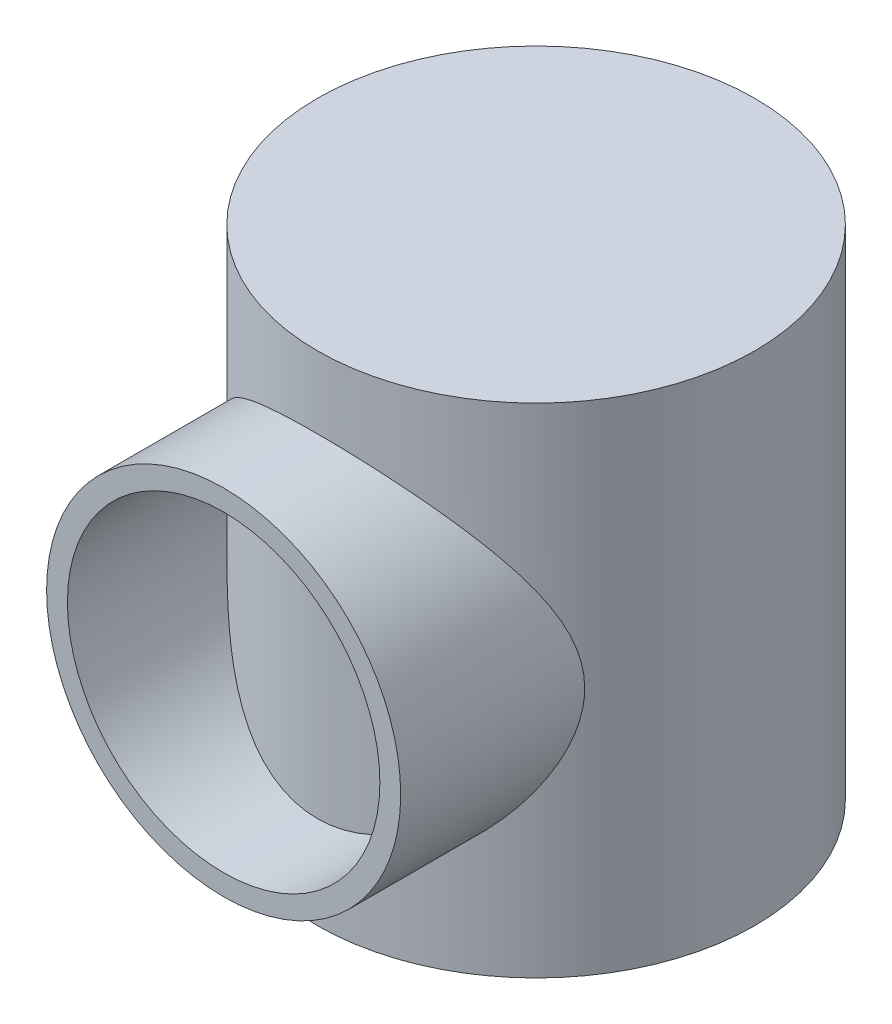
ISO-10303-21;
HEADER;
FILE_DESCRIPTION(('STEP AP214'),'2;1');
FILE_NAME('part.step','',(''),(''),'','','');
FILE_SCHEMA(('AUTOMOTIVE_DESIGN { 1 0 10303 214 1 1 1 1 }'));
ENDSEC;
DATA;
#1=APPLICATION_CONTEXT('core data for automotive mechanical design processes');
#2=APPLICATION_PROTOCOL_DEFINITION('international standard','automotive_design',2000,#1);
#3=PRODUCT_CONTEXT('',#1,'mechanical');
#4=PRODUCT('Part','Part','',(#3));
#5=PRODUCT_RELATED_PRODUCT_CATEGORY('part','',(#4));
#6=PRODUCT_DEFINITION_FORMATION('','',#4);
#7=PRODUCT_DEFINITION_CONTEXT('part definition',#1,'design');
#8=PRODUCT_DEFINITION('design','',#6,#7);
#9=PRODUCT_DEFINITION_SHAPE('','',#8);
#10=(LENGTH_UNIT() NAMED_UNIT(*) SI_UNIT(.MILLI.,.METRE.));
#11=(NAMED_UNIT(*) PLANE_ANGLE_UNIT() SI_UNIT($,.RADIAN.));
#12=(NAMED_UNIT(*) SI_UNIT($,.STERADIAN.) SOLID_ANGLE_UNIT());
#13=UNCERTAINTY_MEASURE_WITH_UNIT(LENGTH_MEASURE(1.E-05),#10,'distance_accuracy_value','');
#14=(GEOMETRIC_REPRESENTATION_CONTEXT(3) GLOBAL_UNCERTAINTY_ASSIGNED_CONTEXT((#13)) GLOBAL_UNIT_ASSIGNED_CONTEXT((#10,
#11,#12)) REPRESENTATION_CONTEXT('',''));
#15=CARTESIAN_POINT('',(0.,0.,0.));
#16=DIRECTION('',(0.,0.,1.));
#17=DIRECTION('',(1.,0.,0.));
#18=AXIS2_PLACEMENT_3D('',#15,#16,#17);
#19=CARTESIAN_POINT('',(0.,47.8,0.));
#20=DIRECTION('',(0.,-1.,0.));
#21=DIRECTION('',(0.,0.,-1.));
#22=AXIS2_PLACEMENT_3D('',#19,#20,#21);
#23=CYLINDRICAL_SURFACE('',#22,21.);
#24=CARTESIAN_POINT('',(17.,23.9,12.328828005938));
#25=CARTESIAN_POINT('',(16.9999967369274,24.214135155578,12.3288360408828));
#26=CARTESIAN_POINT('',(16.9912697652855,24.5283503410388,12.340893860795));
#27=CARTESIAN_POINT('',(16.9565753489187,25.1541512471718,12.388518021646));
#28=CARTESIAN_POINT('',(16.9305974856869,25.4657352635417,12.4240985688478));
#29=CARTESIAN_POINT('',(16.8619400209792,26.084519324395,12.5171205025383));
#30=CARTESIAN_POINT('',(16.8192191367521,26.3917065723134,12.57461591414));
#31=CARTESIAN_POINT('',(16.7179506474076,26.9992005925022,12.7089408555609));
#32=CARTESIAN_POINT('',(16.6593973403827,27.2995048435728,12.7857773502107));
#33=CARTESIAN_POINT('',(16.5037152330106,27.9984841885425,12.9864836788223));
#34=CARTESIAN_POINT('',(16.4002847387583,28.3937540416428,13.1173345462537));
#35=CARTESIAN_POINT('',(16.1681911920748,29.168129778086,13.4023633312182));
#36=CARTESIAN_POINT('',(16.0395164146096,29.5472280503382,13.5565520806997));
#37=CARTESIAN_POINT('',(15.7583984800786,30.2899065446653,13.8823365367469));
#38=CARTESIAN_POINT('',(15.6058979451173,30.6534465337512,14.0539739056364));
#39=CARTESIAN_POINT('',(15.2786688037251,31.3642725780745,14.4090466081906));
#40=CARTESIAN_POINT('',(15.1039408431535,31.7115591051858,14.5924815989768));
#41=CARTESIAN_POINT('',(14.661990015544,32.5204648742148,15.0385740989195));
#42=CARTESIAN_POINT('',(14.3849852063408,32.9748829984665,15.3046467676687));
#43=CARTESIAN_POINT('',(13.7912578509036,33.8540246731914,15.8417708006301));
#44=CARTESIAN_POINT('',(13.4745203263063,34.27873693066,16.1128240093324));
#45=CARTESIAN_POINT('',(12.8022046970443,35.0974935633513,16.652000453939));
#46=CARTESIAN_POINT('',(12.446660157237,35.4915639438766,16.9201260046252));
#47=CARTESIAN_POINT('',(11.6968426649288,36.2477608497717,17.4468824704511));
#48=CARTESIAN_POINT('',(11.302583167235,36.6098983904622,17.7055166415526));
#49=CARTESIAN_POINT('',(10.5590636402511,37.2300747509416,18.1564111852177));
#50=CARTESIAN_POINT('',(10.2167568272387,37.494381163479,18.3515404971172));
#51=CARTESIAN_POINT('',(9.50804013255023,37.9991629379709,18.7285402053346));
#52=CARTESIAN_POINT('',(9.14163130023164,38.2396393362992,18.91041117817));
#53=CARTESIAN_POINT('',(8.38597023281744,38.6942444562387,19.2574180077326));
#54=CARTESIAN_POINT('',(7.99674767714852,38.9084063352365,19.4225748776408));
#55=CARTESIAN_POINT('',(7.19635756416797,39.3081936253583,19.733134197318));
#56=CARTESIAN_POINT('',(6.78519375856683,39.4938238941423,19.8785400093197));
#57=CARTESIAN_POINT('',(6.0123784509531,39.8058226891175,20.1243027629978));
#58=CARTESIAN_POINT('',(5.65373458899104,39.9369160004551,20.2281346610685));
#59=CARTESIAN_POINT('',(4.92418503901672,40.1757381208853,20.4179920469961));
#60=CARTESIAN_POINT('',(4.55328158294506,40.2834711561645,20.5040207555595));
#61=CARTESIAN_POINT('',(3.80134174255069,40.4740813802181,20.6566433447979));
#62=CARTESIAN_POINT('',(3.42030891625452,40.5569671744174,20.7232439538536));
#63=CARTESIAN_POINT('',(2.65044858335967,40.696670944339,20.8357009723686));
#64=CARTESIAN_POINT('',(2.2616209846955,40.7534886119763,20.8815571366606));
#65=CARTESIAN_POINT('',(1.47756005774638,40.8402760077298,20.9516656312471));
#66=CARTESIAN_POINT('',(1.08230830799197,40.8701452853878,20.975837129807));
#67=CARTESIAN_POINT('',(0.289942913955463,40.9021511719296,21.0017393436373));
#68=CARTESIAN_POINT('',(-0.107170734005116,40.9042877259997,21.0034700145534));
#69=CARTESIAN_POINT('',(-0.900034590519789,40.8807904325199,20.9844513134288));
#70=CARTESIAN_POINT('',(-1.29578477955281,40.8551561890106,20.9637016208605));
#71=CARTESIAN_POINT('',(-2.08275874272161,40.7765662570651,20.9001902630574));
#72=CARTESIAN_POINT('',(-2.47398263448224,40.7236112802504,20.8574291711524));
#73=CARTESIAN_POINT('',(-3.22644405471656,40.5951245670363,20.753935223099));
#74=CARTESIAN_POINT('',(-3.58810271292487,40.5210841467738,20.6943915507791));
#75=CARTESIAN_POINT('',(-4.30266695815612,40.3505918615258,20.5577084442266));
#76=CARTESIAN_POINT('',(-4.65557296015555,40.2541410613066,20.4805698459707));
#77=CARTESIAN_POINT('',(-5.35086677557757,40.0400301672437,20.3100070539208));
#78=CARTESIAN_POINT('',(-5.69325354795329,39.9223679820555,20.2165812543139));
#79=CARTESIAN_POINT('',(-6.36605409904459,39.6671444250869,20.0149126165906));
#80=CARTESIAN_POINT('',(-6.69646623971744,39.5295803436237,19.9066677609381));
#81=CARTESIAN_POINT('',(-7.374442699768,39.2221664037423,19.6661834418485));
#82=CARTESIAN_POINT('',(-7.7207226350162,39.050500508394,19.532646822566));
#83=CARTESIAN_POINT('',(-8.39650545319533,38.6866830390986,19.2518211866254));
#84=CARTESIAN_POINT('',(-8.7260074733357,38.4945304132072,19.1045314638267));
#85=CARTESIAN_POINT('',(-9.36761409096434,38.0912448710279,18.7982502112933));
#86=CARTESIAN_POINT('',(-9.67971344577913,37.8801062846034,18.6392551883705));
#87=CARTESIAN_POINT('',(-10.2859901067227,37.4402622023958,18.3116674206814));
#88=CARTESIAN_POINT('',(-10.5801653178152,37.2115546601281,18.1430735584073));
#89=CARTESIAN_POINT('',(-11.2093203157591,36.6887174382754,17.762678812393));
#90=CARTESIAN_POINT('',(-11.5401514000918,36.3908417033285,17.5491549158952));
#91=CARTESIAN_POINT('',(-12.175108470449,35.7727879378189,17.1147520953485));
#92=CARTESIAN_POINT('',(-12.4792301839436,35.4526063537661,16.893872002341));
#93=CARTESIAN_POINT('',(-13.0609666051255,34.7906186446061,16.4482687227839));
#94=CARTESIAN_POINT('',(-13.3385469884199,34.4487854430995,16.2235409913226));
#95=CARTESIAN_POINT('',(-13.866527627173,33.7444466489955,15.7746451320557));
#96=CARTESIAN_POINT('',(-14.1169306717756,33.3819431835724,15.5504769491364));
#97=CARTESIAN_POINT('',(-14.5739673760698,32.661775730958,15.1225219255049));
#98=CARTESIAN_POINT('',(-14.7824226977769,32.3054737225462,14.9183890975595));
#99=CARTESIAN_POINT('',(-15.1747446383514,31.5745799219249,14.5191400997333));
#100=CARTESIAN_POINT('',(-15.3586076160736,31.1999854325122,14.3240252678506));
#101=CARTESIAN_POINT('',(-15.7002868420885,30.4327682867143,13.948666065864));
#102=CARTESIAN_POINT('',(-15.8581467616103,30.0401773024484,13.7683970228044));
#103=CARTESIAN_POINT('',(-16.1464338369641,29.2361819152908,13.4291547194913));
#104=CARTESIAN_POINT('',(-16.2768749915669,28.8247872439642,13.270170607251));
#105=CARTESIAN_POINT('',(-16.4702432680769,28.121060131251,13.0286854985457));
#106=CARTESIAN_POINT('',(-16.5413089655883,27.8337046884963,12.938159955299));
#107=CARTESIAN_POINT('',(-16.66905579353,27.2513260321007,12.7731541413848));
#108=CARTESIAN_POINT('',(-16.7257417604605,26.9563054334729,12.6986684771173));
#109=CARTESIAN_POINT('',(-16.8237473350659,26.3601954385224,12.5685391513679));
#110=CARTESIAN_POINT('',(-16.8650966700487,26.0591189879021,12.5128590576019));
#111=CARTESIAN_POINT('',(-16.9317572342813,25.4520353031231,12.4225107252699));
#112=CARTESIAN_POINT('',(-16.9570688805802,25.1460281973948,12.3878419403202));
#113=CARTESIAN_POINT('',(-16.9911810809505,24.5291595280482,12.341014177152));
#114=CARTESIAN_POINT('',(-16.9998631862266,24.2182789252881,12.329016689971));
#115=CARTESIAN_POINT('',(-17.0001335995289,23.5965051375697,12.3286437539693));
#116=CARTESIAN_POINT('',(-16.9917223329653,23.2856119531172,12.3402677172711));
#117=CARTESIAN_POINT('',(-16.9580053748674,22.6661486938876,12.3865595868818));
#118=CARTESIAN_POINT('',(-16.9326810526091,22.3575815608784,12.4212529052565));
#119=CARTESIAN_POINT('',(-16.8657239288056,21.7454168525645,12.5120144446774));
#120=CARTESIAN_POINT('',(-16.8240886022935,21.441820054259,12.5680859750658));
#121=CARTESIAN_POINT('',(-16.7140603724654,20.7727176901589,12.7141787933353));
#122=CARTESIAN_POINT('',(-16.641727327073,20.4089165470077,12.8090298829562));
#123=CARTESIAN_POINT('',(-16.4754226968904,19.6933971532315,13.0222374932613));
#124=CARTESIAN_POINT('',(-16.3814447624795,19.3416824830869,13.1406009099832));
#125=CARTESIAN_POINT('',(-16.1731762122193,18.6503282169047,13.3961029776428));
#126=CARTESIAN_POINT('',(-16.0588346938896,18.3107215009883,13.5332884757736));
#127=CARTESIAN_POINT('',(-15.811298158311,17.6446750026461,13.8216860626879));
#128=CARTESIAN_POINT('',(-15.6781021572658,17.3182359084281,13.9728988832523));
#129=CARTESIAN_POINT('',(-15.3231874197405,16.5193004250671,14.3631365749515));
#130=CARTESIAN_POINT('',(-15.090360472746,16.0547939787844,14.6084716593709));
#131=CARTESIAN_POINT('',(-14.5866721786715,15.1538307598641,15.111449827842));
#132=CARTESIAN_POINT('',(-14.315793653092,14.7173867865613,15.3690984360164));
#133=CARTESIAN_POINT('',(-13.7367769313514,13.8718536303653,15.8887531190829));
#134=CARTESIAN_POINT('',(-13.4285985805352,13.46279467733,16.150763623363));
#135=CARTESIAN_POINT('',(-12.7757456732519,12.6731257842068,16.6719776125368));
#136=CARTESIAN_POINT('',(-12.4310772662868,12.2925110689266,16.9311815623163));
#137=CARTESIAN_POINT('',(-11.698152528309,11.5537758130082,17.445850699002));
#138=CARTESIAN_POINT('',(-11.3091638665907,11.1962554290031,17.7011381665633));
#139=CARTESIAN_POINT('',(-10.4936703008684,10.5147349639019,18.1964442355197));
#140=CARTESIAN_POINT('',(-10.0671593060584,10.1907403435136,18.4364603470577));
#141=CARTESIAN_POINT('',(-9.17853195466103,9.58064264965329,18.8945371066598));
#142=CARTESIAN_POINT('',(-8.71651415816959,9.29444028295095,19.1126549120308));
#143=CARTESIAN_POINT('',(-7.99779555860542,8.89632421884715,19.4191442947805));
#144=CARTESIAN_POINT('',(-7.75398012928515,8.7688339669669,19.5178459622672));
#145=CARTESIAN_POINT('',(-7.25797868107249,8.52475535143654,19.7076698746178));
#146=CARTESIAN_POINT('',(-7.00579073514772,8.40816952146897,19.7987903574248));
#147=CARTESIAN_POINT('',(-6.40083690077768,8.14647067401915,20.0041226794057));
#148=CARTESIAN_POINT('',(-6.04469285828345,8.00629733604774,20.1147615079329));
#149=CARTESIAN_POINT('',(-5.31939475585028,7.74908513289632,20.3186097676768));
#150=CARTESIAN_POINT('',(-4.95024413565398,7.6320402044493,20.4118237665821));
#151=CARTESIAN_POINT('',(-4.20094435917836,7.42264334808949,20.579098999902));
#152=CARTESIAN_POINT('',(-3.82080107553071,7.33027849583428,20.6531702582246));
#153=CARTESIAN_POINT('',(-3.05169350541449,7.17154109990924,20.7807387805619));
#154=CARTESIAN_POINT('',(-2.66272893064503,7.10516940705684,20.8342353711182));
#155=CARTESIAN_POINT('',(-1.87705062112982,6.99927592399874,20.919691443128));
#156=CARTESIAN_POINT('',(-1.48031047005971,6.95987261251971,20.9515558843406));
#157=CARTESIAN_POINT('',(-0.683865612461865,6.90907462037703,20.9926492205838));
#158=CARTESIAN_POINT('',(-0.284160915940499,6.89767984521801,21.0018781919821));
#159=CARTESIAN_POINT('',(0.514924233019889,6.90310327715694,20.9974878543287));
#160=CARTESIAN_POINT('',(0.914304688834231,6.91992118669556,20.9838687862554));
#161=CARTESIAN_POINT('',(1.70947464087307,6.98146848737073,20.9340961217596));
#162=CARTESIAN_POINT('',(2.10526425508955,7.02619695799545,20.8979432685188));
#163=CARTESIAN_POINT('',(2.86458767136012,7.13898129226354,20.8069872315413));
#164=CARTESIAN_POINT('',(3.22854278674624,7.20532720093222,20.7535528282986));
#165=CARTESIAN_POINT('',(3.94838185665408,7.36077816327135,20.6287109167317));
#166=CARTESIAN_POINT('',(4.30426623404533,7.4498820215163,20.5573043524487));
#167=CARTESIAN_POINT('',(5.00610432598171,7.64970513624737,20.3977563855731));
#168=CARTESIAN_POINT('',(5.35205656774548,7.76042757963812,20.3096125157026));
#169=CARTESIAN_POINT('',(6.03241711639152,8.00219176997079,20.1180235633245));
#170=CARTESIAN_POINT('',(6.36682476030298,8.13323468148948,20.0145776038617));
#171=CARTESIAN_POINT('',(7.04934655271737,8.42565174179167,19.7850094195827));
#172=CARTESIAN_POINT('',(7.3963875436927,8.58862053519719,19.6577306963773));
#173=CARTESIAN_POINT('',(8.07438223656298,8.93506392923441,19.3891037772279));
#174=CARTESIAN_POINT('',(8.40533524184571,9.1185394166762,19.2477549728534));
#175=CARTESIAN_POINT('',(9.05042629198719,9.50447668640499,18.952983099598));
#176=CARTESIAN_POINT('',(9.36456105950785,9.7069421482314,18.7995576916575));
#177=CARTESIAN_POINT('',(9.97547323952473,10.1294551990242,18.4826508443243));
#178=CARTESIAN_POINT('',(10.2722482502374,10.3495052109569,18.3191680198421));
#179=CARTESIAN_POINT('',(10.9059714766144,10.8518395298966,17.9504814906717));
#180=CARTESIAN_POINT('',(11.2390152762406,11.1377462591852,17.743493491501));
#181=CARTESIAN_POINT('',(11.8793494654469,11.7315254785626,17.3213209480627));
#182=CARTESIAN_POINT('',(12.186636099623,12.0394011596598,17.106135215192));
#183=CARTESIAN_POINT('',(12.7757049686205,12.6763720002118,16.6708026063268));
#184=CARTESIAN_POINT('',(13.0574503528073,13.005496681921,16.450649116973));
#185=CARTESIAN_POINT('',(13.5947656166257,13.6838570958759,16.0094707831588));
#186=CARTESIAN_POINT('',(13.8503372866745,14.0330914499594,15.7884459993749));
#187=CARTESIAN_POINT('',(14.3336165435367,14.7494231106353,15.3509944311431));
#188=CARTESIAN_POINT('',(14.5614754803975,15.1164065259686,15.1345485504195));
#189=CARTESIAN_POINT('',(14.9904392704336,15.8703744312053,14.7097865003262));
#190=CARTESIAN_POINT('',(15.1915386552075,16.2573629868583,14.5014719987576));
#191=CARTESIAN_POINT('',(15.5655437636378,17.0511953540168,14.0992601820433));
#192=CARTESIAN_POINT('',(15.7384887319833,17.4580104825474,13.9053430071648));
#193=CARTESIAN_POINT('',(16.0546749803878,18.2923114552687,13.539050614718));
#194=CARTESIAN_POINT('',(16.1979340364282,18.7197847390785,13.3666625302057));
#195=CARTESIAN_POINT('',(16.4093333601936,19.4474722553252,13.1054110672385));
#196=CARTESIAN_POINT('',(16.4865155722847,19.7420003318666,13.0079828316778));
#197=CARTESIAN_POINT('',(16.6257747099719,20.3394355330242,12.8295138016023));
#198=CARTESIAN_POINT('',(16.687857182896,20.6423395348158,12.74846699075));
#199=CARTESIAN_POINT('',(16.7957741035758,21.2545734029698,12.6059495039016));
#200=CARTESIAN_POINT('',(16.8416589426022,21.5638801137029,12.5444181764717));
#201=CARTESIAN_POINT('',(16.9164888448505,22.1879773338033,12.4433279782195));
#202=CARTESIAN_POINT('',(16.9454450217227,22.5027641053989,12.4037546928348));
#203=CARTESIAN_POINT('',(16.9770360484753,22.9985386974169,12.3604443766122));
#204=CARTESIAN_POINT('',(16.985638686929,23.1784845887967,12.3486102830775));
#205=CARTESIAN_POINT('',(16.9971222484764,23.5389447623125,12.3327988988584));
#206=CARTESIAN_POINT('',(17.0000018753643,23.7194591639398,12.3288233880668));
#207=CARTESIAN_POINT('',(17.,23.9,12.328828005938));
#208=B_SPLINE_CURVE_WITH_KNOTS('',3,(#24,#25,#26,#27,#28,#29,#30,#31,#32,#33,#34,#35,#36,#37,
#38,#39,#40,#41,#42,#43,#44,#45,#46,#47,#48,#49,#50,#51,#52,#53,#54,#55,#56,#57,#58,#59,#60,#61,
#62,#63,#64,#65,#66,#67,#68,#69,#70,#71,#72,#73,#74,#75,#76,#77,#78,#79,#80,#81,#82,#83,#84,#85,
#86,#87,#88,#89,#90,#91,#92,#93,#94,#95,#96,#97,#98,#99,#100,#101,#102,#103,#104,#105,#106,#107,
#108,#109,#110,#111,#112,#113,#114,#115,#116,#117,#118,#119,#120,#121,#122,#123,#124,#125,#126,
#127,#128,#129,#130,#131,#132,#133,#134,#135,#136,#137,#138,#139,#140,#141,#142,#143,#144,#145,
#146,#147,#148,#149,#150,#151,#152,#153,#154,#155,#156,#157,#158,#159,#160,#161,#162,#163,#164,
#165,#166,#167,#168,#169,#170,#171,#172,#173,#174,#175,#176,#177,#178,#179,#180,#181,#182,#183,
#184,#185,#186,#187,#188,#189,#190,#191,#192,#193,#194,#195,#196,#197,#198,#199,#200,#201,#202,
#203,#204,#205,#206,#207),.UNSPECIFIED.,.T.,.F.,(4,2,2,2,2,2,2,2,2,2,2,2,2,2,2,2,2,2,2,2,2,2,2,
2,2,2,2,2,2,2,2,2,2,2,2,2,2,2,2,2,2,2,2,2,2,2,2,2,2,2,2,2,2,2,2,2,2,2,2,2,2,2,2,2,2,2,2,2,2,2,2,
2,2,2,2,2,2,2,2,2,2,2,2,2,2,2,2,2,2,2,2,4),(0.,0.94220038035074,1.88497031152864,
2.8300795758419,3.77552966731447,5.060532255254,6.34613309831876,7.63487909272301,
8.92358764875696,10.7062742811845,12.4896349784495,14.2714652593155,16.0526784686063,
17.4747773113784,18.8968142795237,20.3170406358268,21.7370249224736,22.9229883125701,
24.1087369666753,25.2940744809359,26.4794260036951,27.6691778998895,28.8589321476305,
30.0487033592541,31.2384435825394,32.3590246578008,33.479552502683,34.6001908869115,
35.7209819921342,36.9465561997718,38.1721933680423,39.3981977949916,40.6243452477964,
42.1041558113353,43.5842026613344,45.0661383923257,46.5479218917725,47.928450627417,
49.3091835385727,50.6875733775105,52.0652577549184,52.9931722211342,53.9207741761578,
54.8465686268849,55.7723390019725,56.7046792781113,57.6369963509728,58.5703421234967,
59.5038324364198,60.6506144005814,61.7977332075884,62.9477607562919,64.0978483336946,
65.8191877778119,67.5413068382643,69.2652965955424,70.9889962778137,72.7470797541155,
74.5054491394361,76.2591026444583,77.1356601641849,78.0124208519226,79.2063907207742,
80.4000471659742,81.5930772924142,82.7861464662822,83.984424009385,85.1826975097265,
86.3809583719508,87.5791797166956,88.6993236123048,89.8194086812931,90.9396589925029,
92.0599735295943,93.2707376690912,94.4815541882455,95.6926058044706,96.903824579573,
98.3583332849966,99.8130536907708,101.269840614351,102.726527819519,104.174863532778,
105.623494765096,107.070089120064,108.515814732318,109.474108525517,110.432049728066,
111.386983926713,112.341290505961,112.88267254244,113.42417718267),.UNSPECIFIED.);
#209=CARTESIAN_POINT('',(17.,23.9,12.328828005938));
#210=VERTEX_POINT('',#209);
#211=EDGE_CURVE('E57',#210,#210,#208,.T.);
#212=ORIENTED_EDGE('',*,*,#211,.F.);
#213=EDGE_LOOP('',(#212));
#214=FACE_BOUND('',#213,.T.);
#215=CARTESIAN_POINT('',(0.,47.8,0.));
#216=DIRECTION('',(0.,1.,0.));
#217=DIRECTION('',(0.,0.,1.));
#218=AXIS2_PLACEMENT_3D('',#215,#216,#217);
#219=CIRCLE('',#218,21.);
#220=CARTESIAN_POINT('',(0.,47.8,21.));
#221=VERTEX_POINT('',#220);
#222=EDGE_CURVE('E48',#221,#221,#219,.T.);
#223=ORIENTED_EDGE('',*,*,#222,.F.);
#224=EDGE_LOOP('',(#223));
#225=FACE_BOUND('',#224,.T.);
#226=CARTESIAN_POINT('',(0.,0.,0.));
#227=DIRECTION('',(0.,1.,0.));
#228=DIRECTION('',(0.,0.,1.));
#229=AXIS2_PLACEMENT_3D('',#226,#227,#228);
#230=CIRCLE('',#229,21.);
#231=CARTESIAN_POINT('',(0.,0.,21.));
#232=VERTEX_POINT('',#231);
#233=EDGE_CURVE('E52',#232,#232,#230,.T.);
#234=ORIENTED_EDGE('',*,*,#233,.T.);
#235=EDGE_LOOP('',(#234));
#236=FACE_BOUND('',#235,.T.);
#237=ADVANCED_FACE('F37',(#214,#225,#236),#23,.T.);
#238=CARTESIAN_POINT('',(0.,47.8,0.));
#239=DIRECTION('',(0.,1.,0.));
#240=DIRECTION('',(0.,0.,1.));
#241=AXIS2_PLACEMENT_3D('',#238,#239,#240);
#242=PLANE('',#241);
#243=ORIENTED_EDGE('',*,*,#222,.T.);
#244=EDGE_LOOP('',(#243));
#245=FACE_BOUND('',#244,.T.);
#246=ADVANCED_FACE('F92',(#245),#242,.T.);
#247=CARTESIAN_POINT('',(0.,0.,0.));
#248=DIRECTION('',(0.,1.,0.));
#249=DIRECTION('',(0.,0.,1.));
#250=AXIS2_PLACEMENT_3D('',#247,#248,#249);
#251=PLANE('',#250);
#252=ORIENTED_EDGE('',*,*,#233,.F.);
#253=EDGE_LOOP('',(#252));
#254=FACE_BOUND('',#253,.T.);
#255=ADVANCED_FACE('F87',(#254),#251,.F.);
#256=CARTESIAN_POINT('',(0.,23.9,-21.001));
#257=DIRECTION('',(0.,0.,1.));
#258=DIRECTION('',(1.,0.,0.));
#259=AXIS2_PLACEMENT_3D('',#256,#257,#258);
#260=CYLINDRICAL_SURFACE('',#259,17.);
#261=CARTESIAN_POINT('',(0.,23.9,30.));
#262=DIRECTION('',(0.,0.,1.));
#263=DIRECTION('',(1.,0.,0.));
#264=AXIS2_PLACEMENT_3D('',#261,#262,#263);
#265=CIRCLE('',#264,17.);
#266=CARTESIAN_POINT('',(17.,23.9,30.));
#267=VERTEX_POINT('',#266);
#268=EDGE_CURVE('E59',#267,#267,#265,.T.);
#269=ORIENTED_EDGE('',*,*,#268,.F.);
#270=EDGE_LOOP('',(#269));
#271=FACE_BOUND('',#270,.T.);
#272=ORIENTED_EDGE('',*,*,#211,.T.);
#273=EDGE_LOOP('',(#272));
#274=FACE_BOUND('',#273,.T.);
#275=ADVANCED_FACE('F71',(#271,#274),#260,.T.);
#276=CARTESIAN_POINT('',(0.,23.9,30.));
#277=DIRECTION('',(0.,0.,1.));
#278=DIRECTION('',(1.,0.,0.));
#279=AXIS2_PLACEMENT_3D('',#276,#277,#278);
#280=PLANE('',#279);
#281=CARTESIAN_POINT('',(0.,23.9,30.));
#282=DIRECTION('',(0.,0.,1.));
#283=DIRECTION('',(1.,0.,0.));
#284=AXIS2_PLACEMENT_3D('',#281,#282,#283);
#285=CIRCLE('',#284,15.);
#286=CARTESIAN_POINT('',(15.,23.9,30.));
#287=VERTEX_POINT('',#286);
#288=EDGE_CURVE('E62',#287,#287,#285,.T.);
#289=ORIENTED_EDGE('',*,*,#288,.F.);
#290=EDGE_LOOP('',(#289));
#291=FACE_BOUND('',#290,.T.);
#292=ORIENTED_EDGE('',*,*,#268,.T.);
#293=EDGE_LOOP('',(#292));
#294=FACE_BOUND('',#293,.T.);
#295=ADVANCED_FACE('F80',(#291,#294),#280,.T.);
#296=CARTESIAN_POINT('',(0.,23.9,-21.001));
#297=DIRECTION('',(0.,0.,1.));
#298=DIRECTION('',(1.,0.,0.));
#299=AXIS2_PLACEMENT_3D('',#296,#297,#298);
#300=CYLINDRICAL_SURFACE('',#299,15.);
#301=ORIENTED_EDGE('',*,*,#288,.T.);
#302=EDGE_LOOP('',(#301));
#303=FACE_BOUND('',#302,.T.);
#304=CARTESIAN_POINT('',(15.,23.9,14.6969384566991));
#305=CARTESIAN_POINT('',(15.000000717089,23.5426640562217,14.6969371500502));
#306=CARTESIAN_POINT('',(14.9872029273326,23.1853356425488,14.7100334614157));
#307=CARTESIAN_POINT('',(14.9363510540468,22.4743566401612,14.7616634208832));
#308=CARTESIAN_POINT('',(14.8982962254096,22.1207061602618,14.8001978194338));
#309=CARTESIAN_POINT('',(14.7977403984719,21.4195509352215,14.9007349718814));
#310=CARTESIAN_POINT('',(14.7351865189981,21.0720611954831,14.9627884823447));
#311=CARTESIAN_POINT('',(14.586914976372,20.3864591741822,15.1073688817838));
#312=CARTESIAN_POINT('',(14.5011957102148,20.0483475433548,15.1898971875479));
#313=CARTESIAN_POINT('',(14.3091595609233,19.3872369961,15.3709181229794));
#314=CARTESIAN_POINT('',(14.2031053274065,19.0641044538652,15.4692048134463));
#315=CARTESIAN_POINT('',(13.9709898880702,18.4295693917341,15.6791556375773));
#316=CARTESIAN_POINT('',(13.8449248886123,18.118169109917,15.7908223068301));
#317=CARTESIAN_POINT('',(13.5739347066845,17.5078365373823,16.0243649235368));
#318=CARTESIAN_POINT('',(13.4290160639883,17.2088999706282,16.1462373257233));
#319=CARTESIAN_POINT('',(13.1211595188693,16.6237031165091,16.3973976360253));
#320=CARTESIAN_POINT('',(12.958220291831,16.3374437631601,16.526686088926));
#321=CARTESIAN_POINT('',(12.5833740626735,15.7262726667374,16.8144077449801));
#322=CARTESIAN_POINT('',(12.3679765420499,15.4039591197767,16.9738212365487));
#323=CARTESIAN_POINT('',(11.9137304389254,14.777905164615,17.2956798701538));
#324=CARTESIAN_POINT('',(11.674880064689,14.4741661783421,17.4581252430488));
#325=CARTESIAN_POINT('',(11.1740507895492,13.8855056605982,17.7828503244344));
#326=CARTESIAN_POINT('',(10.9120430657894,13.6006083735963,17.945129564754));
#327=CARTESIAN_POINT('',(10.365691241577,13.0509159662866,18.2661673293294));
#328=CARTESIAN_POINT('',(10.0813455123349,12.786122314621,18.4249255957669));
#329=CARTESIAN_POINT('',(9.4385658379307,12.2327932603106,18.7634668422792));
#330=CARTESIAN_POINT('',(9.07592571765857,11.9483491056992,18.941998555645));
#331=CARTESIAN_POINT('',(8.32150905356661,11.411330450988,19.2853380424902));
#332=CARTESIAN_POINT('',(7.92972684704314,11.1587621706511,19.4501431354434));
#333=CARTESIAN_POINT('',(7.11946217860458,10.6889371534297,19.7611041062097));
#334=CARTESIAN_POINT('',(6.70102660394621,10.4716206688945,19.9072914465847));
#335=CARTESIAN_POINT('',(5.83948560537665,10.075204218065,20.1768145526251));
#336=CARTESIAN_POINT('',(5.39639165925429,9.89608665577011,20.300160836361));
#337=CARTESIAN_POINT('',(4.61553851810593,9.6235480907125,20.4892742620184));
#338=CARTESIAN_POINT('',(4.28278925050616,9.52015120116583,20.5615118846025));
#339=CARTESIAN_POINT('',(3.60812997927089,9.33622439306776,20.6905595027731));
#340=CARTESIAN_POINT('',(3.2662219998301,9.25568946661961,20.7473728769112));
#341=CARTESIAN_POINT('',(2.57553409734633,9.1185754403625,20.8443797405696));
#342=CARTESIAN_POINT('',(2.22675869054097,9.06198111312936,20.8845837940706));
#343=CARTESIAN_POINT('',(1.52450373282445,8.9734757149971,20.9475573205107));
#344=CARTESIAN_POINT('',(1.17102402002043,8.94156549581699,20.9703261918528));
#345=CARTESIAN_POINT('',(0.461230189946337,8.90287163591282,20.9979445224594));
#346=CARTESIAN_POINT('',(0.10491163354126,8.89614176533076,21.002755634654));
#347=CARTESIAN_POINT('',(-0.60708021831275,8.90806141724051,20.9942421951012));
#348=CARTESIAN_POINT('',(-0.962753516206261,8.92671084338033,20.9809177122053));
#349=CARTESIAN_POINT('',(-1.67083582765463,8.98910927492312,20.9364320039503));
#350=CARTESIAN_POINT('',(-2.02324409391878,9.03286388883137,20.9052667929716));
#351=CARTESIAN_POINT('',(-2.72217508356177,9.14483038001215,20.8257887511936));
#352=CARTESIAN_POINT('',(-3.06869781396007,9.21304222811327,20.777475940847));
#353=CARTESIAN_POINT('',(-3.74462539604398,9.37088839157916,20.6662052129163));
#354=CARTESIAN_POINT('',(-4.07424096289007,9.45991694128538,20.6036625624499));
#355=CARTESIAN_POINT('',(-4.72390533311675,9.6592075184915,20.464483509095));
#356=CARTESIAN_POINT('',(-5.04395436919048,9.76946902904156,20.3878474493348));
#357=CARTESIAN_POINT('',(-5.67300308028043,10.0100594717545,20.2218413334186));
#358=CARTESIAN_POINT('',(-5.98200234618566,10.140389145983,20.132470806386));
#359=CARTESIAN_POINT('',(-6.58777617164176,10.419921648376,19.9424673472872));
#360=CARTESIAN_POINT('',(-6.88454908176341,10.5691270120349,19.8418329023945));
#361=CARTESIAN_POINT('',(-7.49725823571394,10.9028465947144,19.6190946000155));
#362=CARTESIAN_POINT('',(-7.81164518903264,11.0894426379464,19.4958479426892));
#363=CARTESIAN_POINT('',(-8.42318518261624,11.4829874670402,19.2395400482329));
#364=CARTESIAN_POINT('',(-8.72033713763979,11.6899375323329,19.1064781942622));
#365=CARTESIAN_POINT('',(-9.29696092163111,12.1230457556175,18.8326437080185));
#366=CARTESIAN_POINT('',(-9.57641760166616,12.349219993623,18.6918646563609));
#367=CARTESIAN_POINT('',(-10.1168779112357,12.8195159708492,18.4049561217788));
#368=CARTESIAN_POINT('',(-10.3778798849218,13.063639316555,18.2588261605249));
#369=CARTESIAN_POINT('',(-10.9274263119377,13.6155590742189,17.9362951927165));
#370=CARTESIAN_POINT('',(-11.2121689902101,13.9267936117645,17.7592830626234));
#371=CARTESIAN_POINT('',(-11.7544888361987,14.5721020596968,17.4050828253046));
#372=CARTESIAN_POINT('',(-12.0120605724167,14.9061805146891,17.2278946900139));
#373=CARTESIAN_POINT('',(-12.4991447967868,15.5963973839897,16.8778352002464));
#374=CARTESIAN_POINT('',(-12.7286553268559,15.9525373351177,16.7049641476802));
#375=CARTESIAN_POINT('',(-13.158364667825,16.6862557264287,16.3686234388209));
#376=CARTESIAN_POINT('',(-13.3585714196624,17.0638283200149,16.2051512428797));
#377=CARTESIAN_POINT('',(-13.6863792253248,17.752334160108,15.9285317760984));
#378=CARTESIAN_POINT('',(-13.8201741956173,18.0591060318194,15.8123463284524));
#379=CARTESIAN_POINT('',(-14.0682342223167,18.6848243269403,15.5920590301731));
#380=CARTESIAN_POINT('',(-14.1824941830338,19.0037739004316,15.4879603346237));
#381=CARTESIAN_POINT('',(-14.3900795174087,19.6524832966009,15.295282381139));
#382=CARTESIAN_POINT('',(-14.4834350722783,19.9822267360636,15.2066807899235));
#383=CARTESIAN_POINT('',(-14.6480533545438,20.6514365344603,15.0481763749681));
#384=CARTESIAN_POINT('',(-14.7193286836675,20.9908972262141,14.9782628886034));
#385=CARTESIAN_POINT('',(-14.8392827513884,21.6818708657831,14.8594396397825));
#386=CARTESIAN_POINT('',(-14.8876749914994,22.0334803585202,14.8107967260135));
#387=CARTESIAN_POINT('',(-14.9594537810724,22.7418041112426,14.7382963930616));
#388=CARTESIAN_POINT('',(-14.9828415943115,23.0985181123116,14.7144377212319));
#389=CARTESIAN_POINT('',(-15.0040075173428,23.8132924922018,14.6928552576258));
#390=CARTESIAN_POINT('',(-15.0018008638432,24.1713519431432,14.6951159166798));
#391=CARTESIAN_POINT('',(-14.9718695093937,24.8852642904134,14.7256095053266));
#392=CARTESIAN_POINT('',(-14.9441463817845,25.2411173214277,14.7538408335731));
#393=CARTESIAN_POINT('',(-14.8702719255833,25.8910899184758,14.8282579827756));
#394=CARTESIAN_POINT('',(-14.8277418132969,26.1860471245416,14.8708849475828));
#395=CARTESIAN_POINT('',(-14.7257888435956,26.770388244858,14.9718499430716));
#396=CARTESIAN_POINT('',(-14.6663600189736,27.0597701517703,15.0301935231593));
#397=CARTESIAN_POINT('',(-14.5313628599504,27.6317448309565,15.160748473707));
#398=CARTESIAN_POINT('',(-14.4557831789374,27.9143326740488,15.2329695900678));
#399=CARTESIAN_POINT('',(-14.2893195572682,28.4716482659202,15.3892293624981));
#400=CARTESIAN_POINT('',(-14.19843186897,28.7463740706334,15.4732709115634));
#401=CARTESIAN_POINT('',(-13.954985565809,29.4172240133037,15.69384472719));
#402=CARTESIAN_POINT('',(-13.793766916265,29.808314254419,15.8362077270511));
#403=CARTESIAN_POINT('',(-13.4416108857732,30.5708032063749,16.1361896806615));
#404=CARTESIAN_POINT('',(-13.2506610119036,30.942193551057,16.2938150370053));
#405=CARTESIAN_POINT('',(-12.8403507140271,31.6652068802399,16.619086799584));
#406=CARTESIAN_POINT('',(-12.6209435853487,32.0167959750922,16.7867494301182));
#407=CARTESIAN_POINT('',(-12.1551774722692,32.6989903011014,17.1270210084383));
#408=CARTESIAN_POINT('',(-11.9088217174517,33.0295980392234,17.299629361692));
#409=CARTESIAN_POINT('',(-11.3840842546107,33.6765019922462,17.6494848157437));
#410=CARTESIAN_POINT('',(-11.1051022629746,33.9923026401923,17.8267482360352));
#411=CARTESIAN_POINT('',(-10.5204987090209,34.6003254428329,18.1778817802097));
#412=CARTESIAN_POINT('',(-10.2148752162464,34.8925458859342,18.3517516570756));
#413=CARTESIAN_POINT('',(-9.57809003463341,35.451600291621,18.6919863663913));
#414=CARTESIAN_POINT('',(-9.24696012482466,35.7184649480234,18.8583601413318));
#415=CARTESIAN_POINT('',(-8.55971648268536,36.2253182729147,19.1800713223192));
#416=CARTESIAN_POINT('',(-8.20360701394655,36.4653115098372,19.3354106027035));
#417=CARTESIAN_POINT('',(-7.52210692862906,36.8827999387746,19.6094909236858));
#418=CARTESIAN_POINT('',(-7.19996914171237,37.064288144109,19.7302460780245));
#419=CARTESIAN_POINT('',(-6.53954102207906,37.4045299863539,19.9588690604808));
#420=CARTESIAN_POINT('',(-6.20125360127026,37.563287701263,20.0667391996774));
#421=CARTESIAN_POINT('',(-5.51004947671826,37.8563679853,20.2674321721167));
#422=CARTESIAN_POINT('',(-5.15713760872661,37.9906985536364,20.3602599302312));
#423=CARTESIAN_POINT('',(-4.43848094172011,38.2333072272944,20.5289086188415));
#424=CARTESIAN_POINT('',(-4.07273606557427,38.3415851759998,20.6047294470994));
#425=CARTESIAN_POINT('',(-3.32839869615534,38.5311376088611,20.7380233625023));
#426=CARTESIAN_POINT('',(-2.94973816956303,38.6122320781401,20.7953740419628));
#427=CARTESIAN_POINT('',(-2.18477144755609,38.7451157560573,20.8895970026696));
#428=CARTESIAN_POINT('',(-1.79846521463602,38.7969048209031,20.9264691834343));
#429=CARTESIAN_POINT('',(-1.02170439119905,38.8702450848525,20.9787410363619));
#430=CARTESIAN_POINT('',(-0.631251613763121,38.8918089924526,20.9941497330636));
#431=CARTESIAN_POINT('',(0.150376413328262,38.9043367440873,21.0030973082453));
#432=CARTESIAN_POINT('',(0.541551593993087,38.8953033730241,20.9966381770908));
#433=CARTESIAN_POINT('',(1.27905777124655,38.8494312589846,20.9639042945207));
#434=CARTESIAN_POINT('',(1.62568596492999,38.8156882830266,20.9398360033997));
#435=CARTESIAN_POINT('',(2.31418870846484,38.7244762686532,20.8749626635971));
#436=CARTESIAN_POINT('',(2.65606366000692,38.6670092478811,20.8341590381965));
#437=CARTESIAN_POINT('',(3.33286071743108,38.5291262943983,20.7366574660763));
#438=CARTESIAN_POINT('',(3.66778211243335,38.4487080275957,20.6799579027846));
#439=CARTESIAN_POINT('',(4.32868265263163,38.2659344786269,20.5517841324843));
#440=CARTESIAN_POINT('',(4.65466138215189,38.1635781786726,20.4803092399978));
#441=CARTESIAN_POINT('',(5.30351421879953,37.9354465816501,20.322077929712));
#442=CARTESIAN_POINT('',(5.62613715995769,37.8091793010101,20.2350030448302));
#443=CARTESIAN_POINT('',(6.25883134389888,37.5361927905516,20.0483374778047));
#444=CARTESIAN_POINT('',(6.56890254557247,37.3894734937556,19.9487467546735));
#445=CARTESIAN_POINT('',(7.17538792257361,37.0768813295961,19.7387132237937));
#446=CARTESIAN_POINT('',(7.47180201662617,36.9110083482673,19.628270351475));
#447=CARTESIAN_POINT('',(8.05016185205699,36.5613237948353,19.3982416328921));
#448=CARTESIAN_POINT('',(8.3321057748476,36.3775099763395,19.2786546420895));
#449=CARTESIAN_POINT('',(8.92318399372766,35.963428101046,19.0130823037522));
#450=CARTESIAN_POINT('',(9.22981198486556,35.7303666212052,18.8658689669214));
#451=CARTESIAN_POINT('',(9.82223176671354,35.2433173520942,18.564327785072));
#452=CARTESIAN_POINT('',(10.108021755961,34.9893277576047,18.4099993268234));
#453=CARTESIAN_POINT('',(10.658691772943,34.4611597595478,18.0967618221096));
#454=CARTESIAN_POINT('',(10.9235345284369,34.186946975589,17.9378452683004));
#455=CARTESIAN_POINT('',(11.4312558413454,33.6196356292707,17.6186358220175));
#456=CARTESIAN_POINT('',(11.6741331482485,33.3265359932918,17.4583428517514));
#457=CARTESIAN_POINT('',(12.1772825256635,32.6700099061119,17.1120533974619));
#458=CARTESIAN_POINT('',(12.4333431365419,32.3031666497351,16.9263860638692));
#459=CARTESIAN_POINT('',(12.9133358654489,31.5450688791374,16.5631027892635));
#460=CARTESIAN_POINT('',(13.1372597552393,31.1538081497659,16.3854889181816));
#461=CARTESIAN_POINT('',(13.550887633911,30.3481183312636,16.0450952436777));
#462=CARTESIAN_POINT('',(13.740637098059,29.9337210066179,15.8822958718437));
#463=CARTESIAN_POINT('',(14.0837880497591,29.0823997761375,15.5788128999777));
#464=CARTESIAN_POINT('',(14.2372075959927,28.6454871941344,15.4381183239659));
#465=CARTESIAN_POINT('',(14.472912591128,27.8574579485175,15.2169117376356));
#466=CARTESIAN_POINT('',(14.563438893572,27.5105861239656,15.1300411571672));
#467=CARTESIAN_POINT('',(14.7200798599116,26.8067392053268,14.9776908963858));
#468=CARTESIAN_POINT('',(14.7861990860426,26.4497660128592,14.9122072186403));
#469=CARTESIAN_POINT('',(14.8924754394555,25.7293069042053,14.8060746662241));
#470=CARTESIAN_POINT('',(14.9327039307676,25.3658417528027,14.7653575433393));
#471=CARTESIAN_POINT('',(14.9864650099647,24.6349149129747,14.7107909481329));
#472=CARTESIAN_POINT('',(14.9999992626075,24.2674534752106,14.6969398003441));
#473=CARTESIAN_POINT('',(15.,23.9,14.6969384566991));
#474=B_SPLINE_CURVE_WITH_KNOTS('',3,(#304,#305,#306,#307,#308,#309,#310,#311,#312,#313,#314,
#315,#316,#317,#318,#319,#320,#321,#322,#323,#324,#325,#326,#327,#328,#329,#330,#331,#332,#333,
#334,#335,#336,#337,#338,#339,#340,#341,#342,#343,#344,#345,#346,#347,#348,#349,#350,#351,#352,
#353,#354,#355,#356,#357,#358,#359,#360,#361,#362,#363,#364,#365,#366,#367,#368,#369,#370,#371,
#372,#373,#374,#375,#376,#377,#378,#379,#380,#381,#382,#383,#384,#385,#386,#387,#388,#389,#390,
#391,#392,#393,#394,#395,#396,#397,#398,#399,#400,#401,#402,#403,#404,#405,#406,#407,#408,#409,
#410,#411,#412,#413,#414,#415,#416,#417,#418,#419,#420,#421,#422,#423,#424,#425,#426,#427,#428,
#429,#430,#431,#432,#433,#434,#435,#436,#437,#438,#439,#440,#441,#442,#443,#444,#445,#446,#447,
#448,#449,#450,#451,#452,#453,#454,#455,#456,#457,#458,#459,#460,#461,#462,#463,#464,#465,#466,
#467,#468,#469,#470,#471,#472,#473),.UNSPECIFIED.,.T.,.F.,(4,2,2,2,2,2,2,2,2,2,2,2,2,2,2,2,2,2,
2,2,2,2,2,2,2,2,2,2,2,2,2,2,2,2,2,2,2,2,2,2,2,2,2,2,2,2,2,2,2,2,2,2,2,2,2,2,2,2,2,2,2,2,2,2,2,2,
2,2,2,2,2,2,2,2,2,2,2,2,2,2,2,2,2,2,4),(0.,1.07153767310193,2.14310695903089,3.21700208790141,
4.29097154750692,5.35190485167087,6.41303952817561,7.47380710481148,8.53465270578221,
9.79099003303666,11.0474234158992,12.3054432576708,13.5635549140179,15.0443131026802,
16.5253597782469,18.0038694163323,19.4816965136823,20.5481756404692,21.6144209751801,
22.6799871008311,23.7455899919368,24.8134670781082,25.8813401101173,26.9494517981687,
28.0175622122319,29.0577875624231,30.0979875898923,31.1382260903415,32.1786044704435,
33.334906387269,34.4912810344404,35.6486326307169,36.8060879389249,38.1770733860008,
39.5483323771426,40.9196869988273,42.290669310724,43.3526421694787,44.4148916216641,
45.4755973942354,46.5356966758861,47.6087383801277,48.6817258479849,49.7540745856937,
50.8263572070245,51.7285302246257,52.6310222104959,53.5341503292773,54.437499870324,
55.7745096795043,57.1120828177159,58.4518796664284,59.7915161264414,61.1615777070119,
62.5317386456062,63.9002192547387,65.2684668528843,66.4342321638418,67.5997880661096,
68.7649615912918,69.9301421207852,71.102892944912,72.275649523309,73.4479128553624,
74.6200694932523,75.6661287595702,76.7120990806918,77.7581758126559,78.8043010865772,
79.8749071101556,80.9455166398985,82.0161325401387,83.0868826658011,84.3226546223024,
85.5585332859611,86.7965637128291,88.0346645774953,89.4860567607094,90.9378198957681,
92.3876366889729,93.8367312950708,94.9419426462896,96.046947303738,97.1488929830273,
98.2507699384693),.UNSPECIFIED.);
#475=CARTESIAN_POINT('',(15.,23.9,14.6969384566991));
#476=VERTEX_POINT('',#475);
#477=EDGE_CURVE('E10',#476,#476,#474,.T.);
#478=ORIENTED_EDGE('',*,*,#477,.T.);
#479=EDGE_LOOP('',(#478));
#480=FACE_BOUND('',#479,.T.);
#481=ADVANCED_FACE('F76',(#303,#480),#300,.F.);
#482=ORIENTED_EDGE('',*,*,#477,.F.);
#483=EDGE_LOOP('',(#482));
#484=FACE_BOUND('',#483,.T.);
#485=ADVANCED_FACE('F79',(#484),#23,.T.);
#486=CLOSED_SHELL('',(#237,#246,#255,#275,#295,#481,#485));
#487=MANIFOLD_SOLID_BREP('B2',#486);
#488=ADVANCED_BREP_SHAPE_REPRESENTATION('',(#18,#487),#14);
#489=SHAPE_DEFINITION_REPRESENTATION(#9,#488);
ENDSEC;
END-ISO-10303-21;
